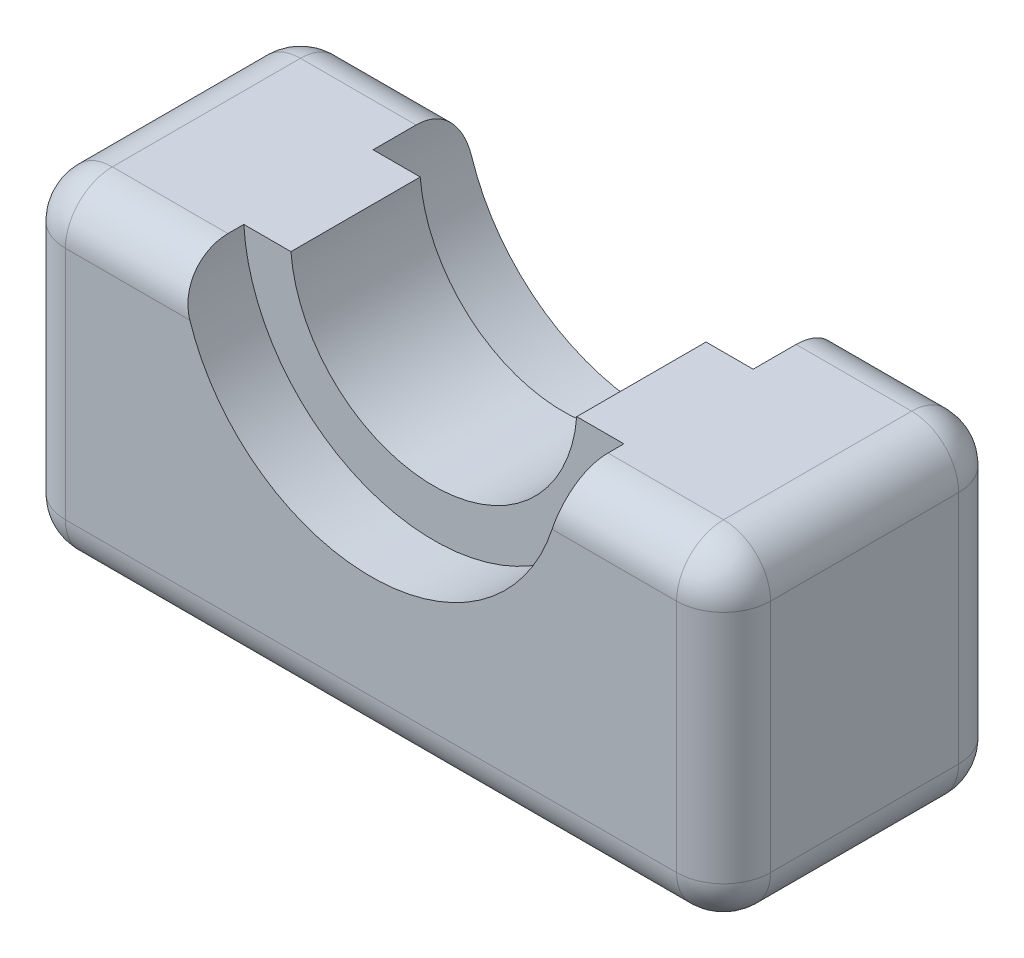
ISO-10303-21;
HEADER;
FILE_DESCRIPTION(('STEP AP214'),'2;1');
FILE_NAME('part.step','',(''),(''),'','','');
FILE_SCHEMA(('AUTOMOTIVE_DESIGN { 1 0 10303 214 1 1 1 1 }'));
ENDSEC;
DATA;
#1=APPLICATION_CONTEXT('core data for automotive mechanical design processes');
#2=APPLICATION_PROTOCOL_DEFINITION('international standard','automotive_design',2000,#1);
#3=PRODUCT_CONTEXT('',#1,'mechanical');
#4=PRODUCT('Part','Part','',(#3));
#5=PRODUCT_RELATED_PRODUCT_CATEGORY('part','',(#4));
#6=PRODUCT_DEFINITION_FORMATION('','',#4);
#7=PRODUCT_DEFINITION_CONTEXT('part definition',#1,'design');
#8=PRODUCT_DEFINITION('design','',#6,#7);
#9=PRODUCT_DEFINITION_SHAPE('','',#8);
#10=(LENGTH_UNIT() NAMED_UNIT(*) SI_UNIT(.MILLI.,.METRE.));
#11=(NAMED_UNIT(*) PLANE_ANGLE_UNIT() SI_UNIT($,.RADIAN.));
#12=(NAMED_UNIT(*) SI_UNIT($,.STERADIAN.) SOLID_ANGLE_UNIT());
#13=UNCERTAINTY_MEASURE_WITH_UNIT(LENGTH_MEASURE(1.E-05),#10,'distance_accuracy_value','');
#14=(GEOMETRIC_REPRESENTATION_CONTEXT(3) GLOBAL_UNCERTAINTY_ASSIGNED_CONTEXT((#13)) GLOBAL_UNIT_ASSIGNED_CONTEXT((#10,
#11,#12)) REPRESENTATION_CONTEXT('',''));
#15=CARTESIAN_POINT('',(0.,0.,0.));
#16=DIRECTION('',(0.,0.,1.));
#17=DIRECTION('',(1.,0.,0.));
#18=AXIS2_PLACEMENT_3D('',#15,#16,#17);
#19=CARTESIAN_POINT('',(-15.,7.,12.));
#20=DIRECTION('',(0.,-1.,0.));
#21=DIRECTION('',(0.,0.,-1.));
#22=AXIS2_PLACEMENT_3D('',#19,#20,#21);
#23=PLANE('',#22);
#24=DIRECTION('',(0.,0.,-1.));
#25=VECTOR('',#24,1.);
#26=CARTESIAN_POINT('',(-13.,7.,12.));
#27=LINE('',#26,#25);
#28=CARTESIAN_POINT('',(-13.,7.,2.));
#29=VERTEX_POINT('',#28);
#30=CARTESIAN_POINT('',(-13.,7.,10.));
#31=VERTEX_POINT('',#30);
#32=EDGE_CURVE('E242',#29,#31,#27,.F.);
#33=ORIENTED_EDGE('',*,*,#32,.T.);
#34=DIRECTION('',(-1.,0.,0.));
#35=VECTOR('',#34,1.);
#36=CARTESIAN_POINT('',(-15.,7.,10.));
#37=LINE('',#36,#35);
#38=CARTESIAN_POINT('',(-8.0845531725631,7.,10.));
#39=VERTEX_POINT('',#38);
#40=EDGE_CURVE('E245',#31,#39,#37,.F.);
#41=ORIENTED_EDGE('',*,*,#40,.T.);
#42=DIRECTION('',(0.,0.,-1.));
#43=VECTOR('',#42,1.);
#44=CARTESIAN_POINT('',(-8.0845531725631,7.,-4.41375541476271));
#45=LINE('',#44,#43);
#46=CARTESIAN_POINT('',(-8.0845531725631,7.,9.325));
#47=VERTEX_POINT('',#46);
#48=EDGE_CURVE('E196',#47,#39,#45,.F.);
#49=ORIENTED_EDGE('',*,*,#48,.F.);
#50=DIRECTION('',(-1.,0.,0.));
#51=VECTOR('',#50,1.);
#52=CARTESIAN_POINT('',(-15.,7.,9.32499999999999));
#53=LINE('',#52,#51);
#54=CARTESIAN_POINT('',(-6.07947366142827,7.,9.325));
#55=VERTEX_POINT('',#54);
#56=EDGE_CURVE('E228',#55,#47,#53,.T.);
#57=ORIENTED_EDGE('',*,*,#56,.F.);
#58=DIRECTION('',(0.,0.,-1.));
#59=VECTOR('',#58,1.);
#60=CARTESIAN_POINT('',(-6.07947366142827,7.,-4.41375541476271));
#61=LINE('',#60,#59);
#62=CARTESIAN_POINT('',(-6.07947366142827,7.,3.82499999999999));
#63=VERTEX_POINT('',#62);
#64=EDGE_CURVE('E229',#63,#55,#61,.F.);
#65=ORIENTED_EDGE('',*,*,#64,.F.);
#66=DIRECTION('',(1.,0.,0.));
#67=VECTOR('',#66,1.);
#68=CARTESIAN_POINT('',(-15.,7.,3.82499999999999));
#69=LINE('',#68,#67);
#70=CARTESIAN_POINT('',(-8.0845531725631,7.,3.82499999999999));
#71=VERTEX_POINT('',#70);
#72=EDGE_CURVE('E198',#71,#63,#69,.T.);
#73=ORIENTED_EDGE('',*,*,#72,.F.);
#74=DIRECTION('',(0.,0.,-1.));
#75=VECTOR('',#74,1.);
#76=CARTESIAN_POINT('',(-8.0845531725631,7.,-4.41375541476271));
#77=LINE('',#76,#75);
#78=CARTESIAN_POINT('',(-8.0845531725631,7.,2.));
#79=VERTEX_POINT('',#78);
#80=EDGE_CURVE('E206',#79,#71,#77,.F.);
#81=ORIENTED_EDGE('',*,*,#80,.F.);
#82=DIRECTION('',(-1.,0.,0.));
#83=VECTOR('',#82,1.);
#84=CARTESIAN_POINT('',(-15.,7.,2.));
#85=LINE('',#84,#83);
#86=EDGE_CURVE('E240',#79,#29,#85,.T.);
#87=ORIENTED_EDGE('',*,*,#86,.T.);
#88=EDGE_LOOP('',(#33,#41,#49,#57,#65,#73,#81,#87));
#89=FACE_BOUND('',#88,.T.);
#90=ADVANCED_FACE('F47',(#89),#23,.F.);
#91=DIRECTION('',(0.,0.,-1.));
#92=VECTOR('',#91,1.);
#93=CARTESIAN_POINT('',(8.0845531725631,7.,-4.41375541476271));
#94=LINE('',#93,#92);
#95=CARTESIAN_POINT('',(8.0845531725631,7.,10.));
#96=VERTEX_POINT('',#95);
#97=CARTESIAN_POINT('',(8.0845531725631,7.,9.325));
#98=VERTEX_POINT('',#97);
#99=EDGE_CURVE('E215',#96,#98,#94,.T.);
#100=ORIENTED_EDGE('',*,*,#99,.F.);
#101=DIRECTION('',(-1.,0.,0.));
#102=VECTOR('',#101,1.);
#103=CARTESIAN_POINT('',(-15.,7.,10.));
#104=LINE('',#103,#102);
#105=CARTESIAN_POINT('',(13.,7.,10.));
#106=VERTEX_POINT('',#105);
#107=EDGE_CURVE('E250',#96,#106,#104,.F.);
#108=ORIENTED_EDGE('',*,*,#107,.T.);
#109=DIRECTION('',(0.,0.,-1.));
#110=VECTOR('',#109,1.);
#111=CARTESIAN_POINT('',(13.,7.,12.));
#112=LINE('',#111,#110);
#113=CARTESIAN_POINT('',(13.,7.,2.));
#114=VERTEX_POINT('',#113);
#115=EDGE_CURVE('E248',#106,#114,#112,.T.);
#116=ORIENTED_EDGE('',*,*,#115,.T.);
#117=DIRECTION('',(-1.,0.,0.));
#118=VECTOR('',#117,1.);
#119=CARTESIAN_POINT('',(8.08455317256309,7.,2.));
#120=LINE('',#119,#118);
#121=CARTESIAN_POINT('',(8.0845531725631,7.,2.));
#122=VERTEX_POINT('',#121);
#123=EDGE_CURVE('E212',#114,#122,#120,.T.);
#124=ORIENTED_EDGE('',*,*,#123,.T.);
#125=DIRECTION('',(0.,0.,-1.));
#126=VECTOR('',#125,1.);
#127=CARTESIAN_POINT('',(8.0845531725631,7.,-4.41375541476271));
#128=LINE('',#127,#126);
#129=CARTESIAN_POINT('',(8.0845531725631,7.,3.82499999999999));
#130=VERTEX_POINT('',#129);
#131=EDGE_CURVE('E203',#130,#122,#128,.T.);
#132=ORIENTED_EDGE('',*,*,#131,.F.);
#133=CARTESIAN_POINT('',(6.07947366142827,7.,3.82499999999999));
#134=VERTEX_POINT('',#133);
#135=EDGE_CURVE('E185',#134,#130,#69,.T.);
#136=ORIENTED_EDGE('',*,*,#135,.F.);
#137=DIRECTION('',(0.,0.,-1.));
#138=VECTOR('',#137,1.);
#139=CARTESIAN_POINT('',(6.07947366142827,7.,-4.41375541476271));
#140=LINE('',#139,#138);
#141=CARTESIAN_POINT('',(6.07947366142827,7.,9.325));
#142=VERTEX_POINT('',#141);
#143=EDGE_CURVE('E195',#142,#134,#140,.T.);
#144=ORIENTED_EDGE('',*,*,#143,.F.);
#145=EDGE_CURVE('E226',#98,#142,#53,.T.);
#146=ORIENTED_EDGE('',*,*,#145,.F.);
#147=EDGE_LOOP('',(#100,#108,#116,#124,#132,#136,#144,#146));
#148=FACE_BOUND('',#147,.T.);
#149=ADVANCED_FACE('F210',(#148),#23,.F.);
#150=CARTESIAN_POINT('',(15.,-7.,12.));
#151=DIRECTION('',(-1.,0.,0.));
#152=DIRECTION('',(0.,0.,1.));
#153=AXIS2_PLACEMENT_3D('',#150,#151,#152);
#154=PLANE('',#153);
#155=DIRECTION('',(0.,0.,-1.));
#156=VECTOR('',#155,1.);
#157=CARTESIAN_POINT('',(15.,5.,12.));
#158=LINE('',#157,#156);
#159=CARTESIAN_POINT('',(15.,5.,2.));
#160=VERTEX_POINT('',#159);
#161=CARTESIAN_POINT('',(15.,5.,10.));
#162=VERTEX_POINT('',#161);
#163=EDGE_CURVE('E256',#160,#162,#158,.F.);
#164=ORIENTED_EDGE('',*,*,#163,.T.);
#165=DIRECTION('',(0.,1.,0.));
#166=VECTOR('',#165,1.);
#167=CARTESIAN_POINT('',(15.,-7.,10.));
#168=LINE('',#167,#166);
#169=CARTESIAN_POINT('',(15.,-5.,10.));
#170=VERTEX_POINT('',#169);
#171=EDGE_CURVE('E259',#162,#170,#168,.F.);
#172=ORIENTED_EDGE('',*,*,#171,.T.);
#173=DIRECTION('',(0.,0.,-1.));
#174=VECTOR('',#173,1.);
#175=CARTESIAN_POINT('',(15.,-5.,12.));
#176=LINE('',#175,#174);
#177=CARTESIAN_POINT('',(15.,-5.,2.));
#178=VERTEX_POINT('',#177);
#179=EDGE_CURVE('E254',#170,#178,#176,.T.);
#180=ORIENTED_EDGE('',*,*,#179,.T.);
#181=DIRECTION('',(0.,1.,0.));
#182=VECTOR('',#181,1.);
#183=CARTESIAN_POINT('',(15.,7.,2.));
#184=LINE('',#183,#182);
#185=EDGE_CURVE('E252',#178,#160,#184,.T.);
#186=ORIENTED_EDGE('',*,*,#185,.T.);
#187=EDGE_LOOP('',(#164,#172,#180,#186));
#188=FACE_BOUND('',#187,.T.);
#189=ADVANCED_FACE('F399',(#188),#154,.F.);
#190=CARTESIAN_POINT('',(-15.,-7.,12.));
#191=DIRECTION('',(1.,0.,0.));
#192=DIRECTION('',(0.,0.,-1.));
#193=AXIS2_PLACEMENT_3D('',#190,#191,#192);
#194=PLANE('',#193);
#195=DIRECTION('',(0.,0.,-1.));
#196=VECTOR('',#195,1.);
#197=CARTESIAN_POINT('',(-15.,-5.,12.));
#198=LINE('',#197,#196);
#199=CARTESIAN_POINT('',(-15.,-5.,2.));
#200=VERTEX_POINT('',#199);
#201=CARTESIAN_POINT('',(-15.,-5.,10.));
#202=VERTEX_POINT('',#201);
#203=EDGE_CURVE('E233',#200,#202,#198,.F.);
#204=ORIENTED_EDGE('',*,*,#203,.T.);
#205=DIRECTION('',(0.,-1.,0.));
#206=VECTOR('',#205,1.);
#207=CARTESIAN_POINT('',(-15.,-7.,10.));
#208=LINE('',#207,#206);
#209=CARTESIAN_POINT('',(-15.,5.,10.));
#210=VERTEX_POINT('',#209);
#211=EDGE_CURVE('E238',#202,#210,#208,.F.);
#212=ORIENTED_EDGE('',*,*,#211,.T.);
#213=DIRECTION('',(0.,0.,-1.));
#214=VECTOR('',#213,1.);
#215=CARTESIAN_POINT('',(-15.,5.,12.));
#216=LINE('',#215,#214);
#217=CARTESIAN_POINT('',(-15.,5.,2.));
#218=VERTEX_POINT('',#217);
#219=EDGE_CURVE('E235',#210,#218,#216,.T.);
#220=ORIENTED_EDGE('',*,*,#219,.T.);
#221=DIRECTION('',(0.,-1.,0.));
#222=VECTOR('',#221,1.);
#223=CARTESIAN_POINT('',(-15.,-7.,2.));
#224=LINE('',#223,#222);
#225=EDGE_CURVE('E231',#218,#200,#224,.T.);
#226=ORIENTED_EDGE('',*,*,#225,.T.);
#227=EDGE_LOOP('',(#204,#212,#220,#226));
#228=FACE_BOUND('',#227,.T.);
#229=ADVANCED_FACE('F402',(#228),#194,.F.);
#230=CARTESIAN_POINT('',(-15.,-7.,12.));
#231=DIRECTION('',(0.,1.,0.));
#232=DIRECTION('',(0.,0.,1.));
#233=AXIS2_PLACEMENT_3D('',#230,#231,#232);
#234=PLANE('',#233);
#235=DIRECTION('',(1.,0.,0.));
#236=VECTOR('',#235,1.);
#237=CARTESIAN_POINT('',(-15.,-7.,10.));
#238=LINE('',#237,#236);
#239=CARTESIAN_POINT('',(13.,-7.,10.));
#240=VERTEX_POINT('',#239);
#241=CARTESIAN_POINT('',(-13.,-7.,10.));
#242=VERTEX_POINT('',#241);
#243=EDGE_CURVE('E261',#240,#242,#238,.F.);
#244=ORIENTED_EDGE('',*,*,#243,.T.);
#245=DIRECTION('',(0.,0.,-1.));
#246=VECTOR('',#245,1.);
#247=CARTESIAN_POINT('',(-13.,-7.,12.));
#248=LINE('',#247,#246);
#249=CARTESIAN_POINT('',(-13.,-7.,2.));
#250=VERTEX_POINT('',#249);
#251=EDGE_CURVE('E267',#242,#250,#248,.T.);
#252=ORIENTED_EDGE('',*,*,#251,.T.);
#253=DIRECTION('',(1.,0.,0.));
#254=VECTOR('',#253,1.);
#255=CARTESIAN_POINT('',(15.,-7.,2.));
#256=LINE('',#255,#254);
#257=CARTESIAN_POINT('',(13.,-7.,2.));
#258=VERTEX_POINT('',#257);
#259=EDGE_CURVE('E265',#250,#258,#256,.T.);
#260=ORIENTED_EDGE('',*,*,#259,.T.);
#261=DIRECTION('',(0.,0.,-1.));
#262=VECTOR('',#261,1.);
#263=CARTESIAN_POINT('',(13.,-7.,12.));
#264=LINE('',#263,#262);
#265=EDGE_CURVE('E263',#258,#240,#264,.F.);
#266=ORIENTED_EDGE('',*,*,#265,.T.);
#267=EDGE_LOOP('',(#244,#252,#260,#266));
#268=FACE_BOUND('',#267,.T.);
#269=ADVANCED_FACE('F545',(#268),#234,.F.);
#270=CARTESIAN_POINT('',(0.,0.,12.));
#271=DIRECTION('',(0.,0.,-1.));
#272=DIRECTION('',(-1.,0.,0.));
#273=AXIS2_PLACEMENT_3D('',#270,#271,#272);
#274=PLANE('',#273);
#275=DIRECTION('',(0.,1.,0.));
#276=VECTOR('',#275,1.);
#277=CARTESIAN_POINT('',(13.,0.,12.));
#278=LINE('',#277,#276);
#279=CARTESIAN_POINT('',(13.,-5.,12.));
#280=VERTEX_POINT('',#279);
#281=CARTESIAN_POINT('',(13.,5.,12.));
#282=VERTEX_POINT('',#281);
#283=EDGE_CURVE('E65',#280,#282,#278,.T.);
#284=ORIENTED_EDGE('',*,*,#283,.T.);
#285=DIRECTION('',(-1.,0.,0.));
#286=VECTOR('',#285,1.);
#287=CARTESIAN_POINT('',(0.,5.,12.));
#288=LINE('',#287,#286);
#289=CARTESIAN_POINT('',(7.70454411370329,5.,12.));
#290=VERTEX_POINT('',#289);
#291=EDGE_CURVE('E286',#282,#290,#288,.T.);
#292=ORIENTED_EDGE('',*,*,#291,.T.);
#293=CARTESIAN_POINT('',(0.,7.5,12.));
#294=DIRECTION('',(0.,0.,-1.));
#295=DIRECTION('',(-1.,0.,0.));
#296=AXIS2_PLACEMENT_3D('',#293,#294,#295);
#297=CIRCLE('',#296,8.1);
#298=CARTESIAN_POINT('',(-7.70454411370329,5.,12.));
#299=VERTEX_POINT('',#298);
#300=EDGE_CURVE('E213',#290,#299,#297,.T.);
#301=ORIENTED_EDGE('',*,*,#300,.T.);
#302=DIRECTION('',(-1.,0.,0.));
#303=VECTOR('',#302,1.);
#304=CARTESIAN_POINT('',(0.,5.,12.));
#305=LINE('',#304,#303);
#306=CARTESIAN_POINT('',(-13.,5.,12.));
#307=VERTEX_POINT('',#306);
#308=EDGE_CURVE('E282',#299,#307,#305,.T.);
#309=ORIENTED_EDGE('',*,*,#308,.T.);
#310=DIRECTION('',(0.,-1.,0.));
#311=VECTOR('',#310,1.);
#312=CARTESIAN_POINT('',(-13.,0.,12.));
#313=LINE('',#312,#311);
#314=CARTESIAN_POINT('',(-13.,-5.,12.));
#315=VERTEX_POINT('',#314);
#316=EDGE_CURVE('E280',#307,#315,#313,.T.);
#317=ORIENTED_EDGE('',*,*,#316,.T.);
#318=DIRECTION('',(1.,0.,0.));
#319=VECTOR('',#318,1.);
#320=CARTESIAN_POINT('',(0.,-5.,12.));
#321=LINE('',#320,#319);
#322=EDGE_CURVE('E70',#315,#280,#321,.T.);
#323=ORIENTED_EDGE('',*,*,#322,.T.);
#324=EDGE_LOOP('',(#284,#292,#301,#309,#317,#323));
#325=FACE_BOUND('',#324,.T.);
#326=ADVANCED_FACE('F390',(#325),#274,.F.);
#327=CARTESIAN_POINT('',(0.,0.,0.));
#328=DIRECTION('',(0.,0.,-1.));
#329=DIRECTION('',(-1.,0.,0.));
#330=AXIS2_PLACEMENT_3D('',#327,#328,#329);
#331=PLANE('',#330);
#332=CARTESIAN_POINT('',(0.,7.5,0.));
#333=DIRECTION('',(0.,0.,-1.));
#334=DIRECTION('',(-1.,0.,0.));
#335=AXIS2_PLACEMENT_3D('',#332,#333,#334);
#336=CIRCLE('',#335,8.1);
#337=CARTESIAN_POINT('',(7.70454411370329,5.,0.));
#338=VERTEX_POINT('',#337);
#339=CARTESIAN_POINT('',(-7.70454411370329,5.,0.));
#340=VERTEX_POINT('',#339);
#341=EDGE_CURVE('E207',#338,#340,#336,.T.);
#342=ORIENTED_EDGE('',*,*,#341,.F.);
#343=DIRECTION('',(-1.,0.,0.));
#344=VECTOR('',#343,1.);
#345=CARTESIAN_POINT('',(15.,5.,0.));
#346=LINE('',#345,#344);
#347=CARTESIAN_POINT('',(13.,5.,0.));
#348=VERTEX_POINT('',#347);
#349=EDGE_CURVE('E278',#338,#348,#346,.F.);
#350=ORIENTED_EDGE('',*,*,#349,.T.);
#351=DIRECTION('',(0.,1.,0.));
#352=VECTOR('',#351,1.);
#353=CARTESIAN_POINT('',(13.,-7.,0.));
#354=LINE('',#353,#352);
#355=CARTESIAN_POINT('',(13.,-5.,0.));
#356=VERTEX_POINT('',#355);
#357=EDGE_CURVE('E276',#348,#356,#354,.F.);
#358=ORIENTED_EDGE('',*,*,#357,.T.);
#359=DIRECTION('',(1.,0.,0.));
#360=VECTOR('',#359,1.);
#361=CARTESIAN_POINT('',(-15.,-5.,0.));
#362=LINE('',#361,#360);
#363=CARTESIAN_POINT('',(-13.,-5.,0.));
#364=VERTEX_POINT('',#363);
#365=EDGE_CURVE('E274',#356,#364,#362,.F.);
#366=ORIENTED_EDGE('',*,*,#365,.T.);
#367=DIRECTION('',(0.,-1.,0.));
#368=VECTOR('',#367,1.);
#369=CARTESIAN_POINT('',(-13.,7.,0.));
#370=LINE('',#369,#368);
#371=CARTESIAN_POINT('',(-13.,5.,0.));
#372=VERTEX_POINT('',#371);
#373=EDGE_CURVE('E270',#364,#372,#370,.F.);
#374=ORIENTED_EDGE('',*,*,#373,.T.);
#375=DIRECTION('',(-1.,0.,0.));
#376=VECTOR('',#375,1.);
#377=CARTESIAN_POINT('',(-8.0845531725631,5.,0.));
#378=LINE('',#377,#376);
#379=EDGE_CURVE('E272',#372,#340,#378,.F.);
#380=ORIENTED_EDGE('',*,*,#379,.T.);
#381=EDGE_LOOP('',(#342,#350,#358,#366,#374,#380));
#382=FACE_BOUND('',#381,.T.);
#383=ADVANCED_FACE('F385',(#382),#331,.T.);
#384=CARTESIAN_POINT('',(8.1,7.5,9.32499999999999));
#385=DIRECTION('',(0.,0.,1.));
#386=DIRECTION('',(1.,0.,0.));
#387=AXIS2_PLACEMENT_3D('',#384,#385,#386);
#388=PLANE('',#387);
#389=ORIENTED_EDGE('',*,*,#145,.T.);
#390=CARTESIAN_POINT('',(0.,7.5,9.325));
#391=DIRECTION('',(0.,0.,-1.));
#392=DIRECTION('',(-1.,0.,0.));
#393=AXIS2_PLACEMENT_3D('',#390,#391,#392);
#394=CIRCLE('',#393,6.1);
#395=EDGE_CURVE('E496',#142,#55,#394,.T.);
#396=ORIENTED_EDGE('',*,*,#395,.T.);
#397=ORIENTED_EDGE('',*,*,#56,.T.);
#398=CARTESIAN_POINT('',(0.,7.5,9.325));
#399=DIRECTION('',(0.,0.,-1.));
#400=DIRECTION('',(-1.,0.,0.));
#401=AXIS2_PLACEMENT_3D('',#398,#399,#400);
#402=CIRCLE('',#401,8.1);
#403=EDGE_CURVE('E218',#98,#47,#402,.T.);
#404=ORIENTED_EDGE('',*,*,#403,.F.);
#405=EDGE_LOOP('',(#389,#396,#397,#404));
#406=FACE_BOUND('',#405,.T.);
#407=ADVANCED_FACE('F382',(#406),#388,.T.);
#408=CARTESIAN_POINT('',(0.,7.5,-4.41375541476271));
#409=DIRECTION('',(0.,0.,-1.));
#410=DIRECTION('',(-1.,0.,0.));
#411=AXIS2_PLACEMENT_3D('',#408,#409,#410);
#412=CYLINDRICAL_SURFACE('',#411,6.1);
#413=ORIENTED_EDGE('',*,*,#64,.T.);
#414=ORIENTED_EDGE('',*,*,#395,.F.);
#415=ORIENTED_EDGE('',*,*,#143,.T.);
#416=CARTESIAN_POINT('',(0.,7.5,3.82499999999999));
#417=DIRECTION('',(0.,0.,-1.));
#418=DIRECTION('',(-1.,0.,0.));
#419=AXIS2_PLACEMENT_3D('',#416,#417,#418);
#420=CIRCLE('',#419,6.1);
#421=EDGE_CURVE('E191',#134,#63,#420,.T.);
#422=ORIENTED_EDGE('',*,*,#421,.T.);
#423=EDGE_LOOP('',(#413,#414,#415,#422));
#424=FACE_BOUND('',#423,.T.);
#425=ADVANCED_FACE('F380',(#424),#412,.F.);
#426=CARTESIAN_POINT('',(6.1,7.5,3.82499999999999));
#427=DIRECTION('',(0.,0.,-1.));
#428=DIRECTION('',(-1.,0.,0.));
#429=AXIS2_PLACEMENT_3D('',#426,#427,#428);
#430=PLANE('',#429);
#431=ORIENTED_EDGE('',*,*,#72,.T.);
#432=ORIENTED_EDGE('',*,*,#421,.F.);
#433=ORIENTED_EDGE('',*,*,#135,.T.);
#434=CARTESIAN_POINT('',(0.,7.5,3.82499999999999));
#435=DIRECTION('',(0.,0.,-1.));
#436=DIRECTION('',(-1.,0.,0.));
#437=AXIS2_PLACEMENT_3D('',#434,#435,#436);
#438=CIRCLE('',#437,8.1);
#439=EDGE_CURVE('E188',#130,#71,#438,.T.);
#440=ORIENTED_EDGE('',*,*,#439,.T.);
#441=EDGE_LOOP('',(#431,#432,#433,#440));
#442=FACE_BOUND('',#441,.T.);
#443=ADVANCED_FACE('F187',(#442),#430,.T.);
#444=CARTESIAN_POINT('',(0.,7.5,-4.41375541476271));
#445=DIRECTION('',(0.,0.,-1.));
#446=DIRECTION('',(-1.,0.,0.));
#447=AXIS2_PLACEMENT_3D('',#444,#445,#446);
#448=CYLINDRICAL_SURFACE('',#447,8.1);
#449=ORIENTED_EDGE('',*,*,#300,.F.);
#450=CARTESIAN_POINT('',(7.70454411370329,5.,12.));
#451=CARTESIAN_POINT('',(7.72221733940313,5.05445630783001,11.9999991391625));
#452=CARTESIAN_POINT('',(7.73930046538512,5.10908208849837,11.9977740298829));
#453=CARTESIAN_POINT('',(7.77221558333223,5.218352249234,11.988801788701));
#454=CARTESIAN_POINT('',(7.78804727575902,5.27299663062898,11.9820535778084));
#455=CARTESIAN_POINT('',(7.83353005142658,5.43637863963121,11.9549253241192));
#456=CARTESIAN_POINT('',(7.86118815572091,5.54462489477543,11.9276618150118));
#457=CARTESIAN_POINT('',(7.91085314314783,5.75635990814549,11.8548556849213));
#458=CARTESIAN_POINT('',(7.93284913711485,5.85983918965886,11.8092782678684));
#459=CARTESIAN_POINT('',(7.97131097957193,6.05832840377433,11.700797672422));
#460=CARTESIAN_POINT('',(7.98778113660569,6.15334489222874,11.6379080624818));
#461=CARTESIAN_POINT('',(8.01541277739852,6.32915834972679,11.4985211081995));
#462=CARTESIAN_POINT('',(8.02671333636947,6.41028572229722,11.422467223029));
#463=CARTESIAN_POINT('',(8.04550858613133,6.55902905238382,11.2576763866301));
#464=CARTESIAN_POINT('',(8.05300200664451,6.62664049566007,11.1689352148406));
#465=CARTESIAN_POINT('',(8.06505577524296,6.74602632383817,10.981673685788));
#466=CARTESIAN_POINT('',(8.06962682086515,6.79785810179217,10.8831905369422));
#467=CARTESIAN_POINT('',(8.0766977613671,6.88449153627053,10.6789557925763));
#468=CARTESIAN_POINT('',(8.07919867464249,6.91930156314255,10.5732077987386));
#469=CARTESIAN_POINT('',(8.08222320874333,6.96333718971312,10.3891690309199));
#470=CARTESIAN_POINT('',(8.08311176358907,6.97707353831897,10.3119311762075));
#471=CARTESIAN_POINT('',(8.08426907149497,6.99540658730904,10.1564721000259));
#472=CARTESIAN_POINT('',(8.08453859907028,7.0000147077644,10.0782522306427));
#473=CARTESIAN_POINT('',(8.0845531725631,7.,10.));
#474=B_SPLINE_CURVE_WITH_KNOTS('',3,(#450,#451,#452,#453,#454,#455,#456,#457,#458,#459,#460,
#461,#462,#463,#464,#465,#466,#467,#468,#469,#470,#471,#472,#473),.UNSPECIFIED.,.F.,.F.,(4,2,2,
2,2,2,2,2,2,2,2,4),(0.,0.171665039148945,0.343371043738461,0.686596939227762,1.03047806430713,
1.37409043571894,1.70781887223384,2.04165858651308,2.37426915476356,2.70671599879677,
2.94156815579039,3.17612630978022),.UNSPECIFIED.);
#475=EDGE_CURVE('E295',#290,#96,#474,.T.);
#476=ORIENTED_EDGE('',*,*,#475,.T.);
#477=ORIENTED_EDGE('',*,*,#99,.T.);
#478=ORIENTED_EDGE('',*,*,#403,.T.);
#479=ORIENTED_EDGE('',*,*,#48,.T.);
#480=CARTESIAN_POINT('',(-8.0845531725631,7.,10.));
#481=CARTESIAN_POINT('',(-8.08454980548533,6.99999965423769,10.0560645785242));
#482=CARTESIAN_POINT('',(-8.08440766001303,6.99764107634881,10.1121023809767));
#483=CARTESIAN_POINT('',(-8.08381878791316,6.98823194226895,10.2237789659602));
#484=CARTESIAN_POINT('',(-8.08337207215608,6.98118155353471,10.2794177626607));
#485=CARTESIAN_POINT('',(-8.08153632306573,6.95305673653088,10.4450609865663));
#486=CARTESIAN_POINT('',(-8.07965183551945,6.9250084927778,10.5539591096366));
#487=CARTESIAN_POINT('',(-8.0740506517572,6.85110591845108,10.7654953140518));
#488=CARTESIAN_POINT('',(-8.07033292724994,6.80524159762912,10.8681298456999));
#489=CARTESIAN_POINT('',(-8.0602875284919,6.69706560419468,11.0641859329372));
#490=CARTESIAN_POINT('',(-8.05396039935022,6.63475736772279,11.1576094076843));
#491=CARTESIAN_POINT('',(-8.0378188909054,6.49584715344973,11.3322330543309));
#492=CARTESIAN_POINT('',(-8.02801746259071,6.41929875494283,11.4134770479865));
#493=CARTESIAN_POINT('',(-8.00405098608367,6.25416277329699,11.5618554473494));
#494=CARTESIAN_POINT('',(-7.98988633179285,6.16557627733179,11.6289911258014));
#495=CARTESIAN_POINT('',(-7.95664395091099,5.97992331128564,11.7469283229109));
#496=CARTESIAN_POINT('',(-7.93760366827528,5.88292503973029,11.7978479706101));
#497=CARTESIAN_POINT('',(-7.89421913393356,5.68292487527609,11.8829283128417));
#498=CARTESIAN_POINT('',(-7.86987438469021,5.57992241987354,11.917087434327));
#499=CARTESIAN_POINT('',(-7.82265176540555,5.39697757260031,11.9618770992592));
#500=CARTESIAN_POINT('',(-7.80089876043411,5.31762852281883,11.9762364055768));
#501=CARTESIAN_POINT('',(-7.75469639405478,5.15871597923491,11.9952993012304));
#502=CARTESIAN_POINT('',(-7.73025217359827,5.07915316810061,12.0000209749964));
#503=CARTESIAN_POINT('',(-7.70454411370329,5.,12.));
#504=B_SPLINE_CURVE_WITH_KNOTS('',3,(#480,#481,#482,#483,#484,#485,#486,#487,#488,#489,#490,
#491,#492,#493,#494,#495,#496,#497,#498,#499,#500,#501,#502,#503),.UNSPECIFIED.,.F.,.F.,(4,2,2,
2,2,2,2,2,2,2,2,4),(0.,0.168090725906928,0.336175452762153,0.671850672590525,1.00771439244278,
1.34350798529702,1.67806279582266,2.01258741239305,2.34461620439159,2.6766761527536,
2.9266564566506,3.17616725491293),.UNSPECIFIED.);
#505=EDGE_CURVE('E288',#39,#299,#504,.T.);
#506=ORIENTED_EDGE('',*,*,#505,.T.);
#507=EDGE_LOOP('',(#449,#476,#477,#478,#479,#506));
#508=FACE_BOUND('',#507,.T.);
#509=ADVANCED_FACE('F300',(#508),#448,.F.);
#510=CARTESIAN_POINT('',(0.,7.5,-4.41375541476271));
#511=DIRECTION('',(0.,0.,-1.));
#512=DIRECTION('',(-1.,0.,0.));
#513=AXIS2_PLACEMENT_3D('',#510,#511,#512);
#514=CYLINDRICAL_SURFACE('',#513,8.1);
#515=ORIENTED_EDGE('',*,*,#341,.T.);
#516=CARTESIAN_POINT('',(-7.70454411370329,5.,0.));
#517=CARTESIAN_POINT('',(-7.72221733940313,5.05445630783001,8.60837539976863E-07));
#518=CARTESIAN_POINT('',(-7.73930046538512,5.10908208849837,0.0022259701170716));
#519=CARTESIAN_POINT('',(-7.77221558333223,5.218352249234,0.0111982112989936));
#520=CARTESIAN_POINT('',(-7.78804727575902,5.27299663062898,0.0179464221915945));
#521=CARTESIAN_POINT('',(-7.83353005142658,5.43637863963121,0.0450746758807502));
#522=CARTESIAN_POINT('',(-7.86118815572091,5.54462489477543,0.0723381849882116));
#523=CARTESIAN_POINT('',(-7.91085314314783,5.75635990814548,0.145144315078657));
#524=CARTESIAN_POINT('',(-7.93284913711485,5.85983918965886,0.190721732131642));
#525=CARTESIAN_POINT('',(-7.97131097957193,6.05832840377432,0.299202327577996));
#526=CARTESIAN_POINT('',(-7.98778113660569,6.15334489222874,0.362091937518172));
#527=CARTESIAN_POINT('',(-8.01541277739852,6.32915834972679,0.501478891800465));
#528=CARTESIAN_POINT('',(-8.02671333636947,6.41028572229722,0.577532776971042));
#529=CARTESIAN_POINT('',(-8.04550858613132,6.55902905238382,0.74232361336989));
#530=CARTESIAN_POINT('',(-8.0530020066445,6.62664049566007,0.831064785159433));
#531=CARTESIAN_POINT('',(-8.06505577524296,6.74602632383817,1.01832631421201));
#532=CARTESIAN_POINT('',(-8.06962682086515,6.79785810179217,1.11680946305782));
#533=CARTESIAN_POINT('',(-8.0766977613671,6.88449153627053,1.32104420742375));
#534=CARTESIAN_POINT('',(-8.07919867464248,6.91930156314255,1.42679220126139));
#535=CARTESIAN_POINT('',(-8.08222320874333,6.96333718971312,1.61083096908014));
#536=CARTESIAN_POINT('',(-8.08311176358907,6.97707353831897,1.68806882379254));
#537=CARTESIAN_POINT('',(-8.08426907149497,6.99540658730904,1.84352789997413));
#538=CARTESIAN_POINT('',(-8.08453859907028,7.0000147077644,1.92174776935732));
#539=CARTESIAN_POINT('',(-8.0845531725631,7.,2.));
#540=B_SPLINE_CURVE_WITH_KNOTS('',3,(#516,#517,#518,#519,#520,#521,#522,#523,#524,#525,#526,
#527,#528,#529,#530,#531,#532,#533,#534,#535,#536,#537,#538,#539),.UNSPECIFIED.,.F.,.F.,(4,2,2,
2,2,2,2,2,2,2,2,4),(0.,0.171665039148945,0.343371043738462,0.686596939227761,1.03047806430713,
1.37409043571894,1.70781887223384,2.04165858651308,2.37426915476355,2.70671599879677,
2.94156815579039,3.17612630978022),.UNSPECIFIED.);
#541=EDGE_CURVE('E13',#340,#79,#540,.T.);
#542=ORIENTED_EDGE('',*,*,#541,.T.);
#543=ORIENTED_EDGE('',*,*,#80,.T.);
#544=ORIENTED_EDGE('',*,*,#439,.F.);
#545=ORIENTED_EDGE('',*,*,#131,.T.);
#546=CARTESIAN_POINT('',(8.0845531725631,7.,2.));
#547=CARTESIAN_POINT('',(8.08454980548532,6.99999965423769,1.94393542147583));
#548=CARTESIAN_POINT('',(8.08440766001302,6.99764107634881,1.88789761902335));
#549=CARTESIAN_POINT('',(8.08381878791316,6.98823194226895,1.77622103403978));
#550=CARTESIAN_POINT('',(8.08337207215608,6.98118155353471,1.72058223733931));
#551=CARTESIAN_POINT('',(8.08153632306573,6.95305673653088,1.5549390134337));
#552=CARTESIAN_POINT('',(8.07965183551945,6.9250084927778,1.44604089036338));
#553=CARTESIAN_POINT('',(8.07405065175719,6.85110591845108,1.23450468594821));
#554=CARTESIAN_POINT('',(8.07033292724994,6.80524159762912,1.13187015430007));
#555=CARTESIAN_POINT('',(8.06028752849189,6.69706560419468,0.935814067062837));
#556=CARTESIAN_POINT('',(8.05396039935022,6.6347573677228,0.842390592315726));
#557=CARTESIAN_POINT('',(8.0378188909054,6.49584715344973,0.667766945669111));
#558=CARTESIAN_POINT('',(8.02801746259071,6.41929875494283,0.586522952013551));
#559=CARTESIAN_POINT('',(8.00405098608367,6.25416277329699,0.438144552650646));
#560=CARTESIAN_POINT('',(7.98988633179284,6.16557627733179,0.371008874198565));
#561=CARTESIAN_POINT('',(7.95664395091099,5.97992331128564,0.253071677089142));
#562=CARTESIAN_POINT('',(7.93760366827528,5.88292503973029,0.202152029389876));
#563=CARTESIAN_POINT('',(7.89421913393356,5.68292487527609,0.117071687158309));
#564=CARTESIAN_POINT('',(7.86987438469021,5.57992241987354,0.0829125656730387));
#565=CARTESIAN_POINT('',(7.82265176540555,5.39697757260032,0.0381229007408486));
#566=CARTESIAN_POINT('',(7.80089876043411,5.31762852281883,0.0237635944231886));
#567=CARTESIAN_POINT('',(7.75469639405478,5.15871597923491,0.00470069876961589));
#568=CARTESIAN_POINT('',(7.73025217359827,5.07915316810061,-2.09749963729266E-05));
#569=CARTESIAN_POINT('',(7.70454411370329,5.,0.));
#570=B_SPLINE_CURVE_WITH_KNOTS('',3,(#546,#547,#548,#549,#550,#551,#552,#553,#554,#555,#556,
#557,#558,#559,#560,#561,#562,#563,#564,#565,#566,#567,#568,#569),.UNSPECIFIED.,.F.,.F.,(4,2,2,
2,2,2,2,2,2,2,2,4),(0.,0.168090725906928,0.336175452762154,0.671850672590525,1.00771439244278,
1.34350798529702,1.67806279582266,2.01258741239306,2.34461620439159,2.6766761527536,
2.9266564566506,3.17616725491293),.UNSPECIFIED.);
#571=EDGE_CURVE('E57',#122,#338,#570,.T.);
#572=ORIENTED_EDGE('',*,*,#571,.T.);
#573=EDGE_LOOP('',(#515,#542,#543,#544,#545,#572));
#574=FACE_BOUND('',#573,.T.);
#575=ADVANCED_FACE('F202',(#574),#514,.F.);
#576=CARTESIAN_POINT('',(0.,5.,10.));
#577=DIRECTION('',(-1.,0.,0.));
#578=DIRECTION('',(0.,0.,1.));
#579=AXIS2_PLACEMENT_3D('',#576,#577,#578);
#580=CYLINDRICAL_SURFACE('',#579,2.);
#581=ORIENTED_EDGE('',*,*,#475,.F.);
#582=ORIENTED_EDGE('',*,*,#291,.F.);
#583=CARTESIAN_POINT('',(13.,5.,10.));
#584=DIRECTION('',(1.,0.,0.));
#585=DIRECTION('',(0.,0.,-1.));
#586=AXIS2_PLACEMENT_3D('',#583,#584,#585);
#587=CIRCLE('',#586,2.);
#588=EDGE_CURVE('E52',#106,#282,#587,.T.);
#589=ORIENTED_EDGE('',*,*,#588,.F.);
#590=ORIENTED_EDGE('',*,*,#107,.F.);
#591=EDGE_LOOP('',(#581,#582,#589,#590));
#592=FACE_BOUND('',#591,.T.);
#593=ADVANCED_FACE('F49',(#592),#580,.T.);
#594=CARTESIAN_POINT('',(13.,5.,12.));
#595=DIRECTION('',(0.,0.,-1.));
#596=DIRECTION('',(-1.,0.,0.));
#597=AXIS2_PLACEMENT_3D('',#594,#595,#596);
#598=CYLINDRICAL_SURFACE('',#597,2.);
#599=CARTESIAN_POINT('',(13.,5.,2.));
#600=DIRECTION('',(0.,0.,-1.));
#601=DIRECTION('',(-1.,0.,0.));
#602=AXIS2_PLACEMENT_3D('',#599,#600,#601);
#603=CIRCLE('',#602,2.);
#604=EDGE_CURVE('E483',#114,#160,#603,.T.);
#605=ORIENTED_EDGE('',*,*,#604,.F.);
#606=ORIENTED_EDGE('',*,*,#115,.F.);
#607=CARTESIAN_POINT('',(13.,5.,10.));
#608=DIRECTION('',(0.,0.,1.));
#609=DIRECTION('',(1.,0.,0.));
#610=AXIS2_PLACEMENT_3D('',#607,#608,#609);
#611=CIRCLE('',#610,2.);
#612=EDGE_CURVE('E485',#162,#106,#611,.T.);
#613=ORIENTED_EDGE('',*,*,#612,.F.);
#614=ORIENTED_EDGE('',*,*,#163,.F.);
#615=EDGE_LOOP('',(#605,#606,#613,#614));
#616=FACE_BOUND('',#615,.T.);
#617=ADVANCED_FACE('F363',(#616),#598,.T.);
#618=CARTESIAN_POINT('',(-15.,5.,2.));
#619=DIRECTION('',(1.,0.,0.));
#620=DIRECTION('',(0.,0.,-1.));
#621=AXIS2_PLACEMENT_3D('',#618,#619,#620);
#622=CYLINDRICAL_SURFACE('',#621,2.);
#623=ORIENTED_EDGE('',*,*,#571,.F.);
#624=ORIENTED_EDGE('',*,*,#123,.F.);
#625=CARTESIAN_POINT('',(13.,5.,2.));
#626=DIRECTION('',(1.,0.,0.));
#627=DIRECTION('',(0.,1.,0.));
#628=AXIS2_PLACEMENT_3D('',#625,#626,#627);
#629=CIRCLE('',#628,2.);
#630=EDGE_CURVE('E480',#348,#114,#629,.T.);
#631=ORIENTED_EDGE('',*,*,#630,.F.);
#632=ORIENTED_EDGE('',*,*,#349,.F.);
#633=EDGE_LOOP('',(#623,#624,#631,#632));
#634=FACE_BOUND('',#633,.T.);
#635=ADVANCED_FACE('F359',(#634),#622,.T.);
#636=CARTESIAN_POINT('',(13.,5.,10.));
#637=DIRECTION('',(0.,0.,1.));
#638=DIRECTION('',(1.,0.,0.));
#639=AXIS2_PLACEMENT_3D('',#636,#637,#638);
#640=SPHERICAL_SURFACE('',#639,2.);
#641=ORIENTED_EDGE('',*,*,#612,.T.);
#642=ORIENTED_EDGE('',*,*,#588,.T.);
#643=CARTESIAN_POINT('',(13.,5.,10.));
#644=DIRECTION('',(0.,1.,0.));
#645=DIRECTION('',(0.,0.,1.));
#646=AXIS2_PLACEMENT_3D('',#643,#644,#645);
#647=CIRCLE('',#646,2.);
#648=EDGE_CURVE('E477',#162,#282,#647,.F.);
#649=ORIENTED_EDGE('',*,*,#648,.F.);
#650=EDGE_LOOP('',(#641,#642,#649));
#651=FACE_BOUND('',#650,.T.);
#652=ADVANCED_FACE('F355',(#651),#640,.T.);
#653=CARTESIAN_POINT('',(13.,5.,2.));
#654=DIRECTION('',(0.,0.,1.));
#655=DIRECTION('',(1.,0.,0.));
#656=AXIS2_PLACEMENT_3D('',#653,#654,#655);
#657=SPHERICAL_SURFACE('',#656,2.);
#658=ORIENTED_EDGE('',*,*,#630,.T.);
#659=ORIENTED_EDGE('',*,*,#604,.T.);
#660=CARTESIAN_POINT('',(13.,5.,2.));
#661=DIRECTION('',(0.,1.,0.));
#662=DIRECTION('',(0.,0.,1.));
#663=AXIS2_PLACEMENT_3D('',#660,#661,#662);
#664=CIRCLE('',#663,2.);
#665=EDGE_CURVE('E474',#348,#160,#664,.F.);
#666=ORIENTED_EDGE('',*,*,#665,.F.);
#667=EDGE_LOOP('',(#658,#659,#666));
#668=FACE_BOUND('',#667,.T.);
#669=ADVANCED_FACE('F351',(#668),#657,.T.);
#670=CARTESIAN_POINT('',(13.,0.,10.));
#671=DIRECTION('',(0.,1.,0.));
#672=DIRECTION('',(0.,0.,1.));
#673=AXIS2_PLACEMENT_3D('',#670,#671,#672);
#674=CYLINDRICAL_SURFACE('',#673,2.);
#675=ORIENTED_EDGE('',*,*,#648,.T.);
#676=ORIENTED_EDGE('',*,*,#283,.F.);
#677=CARTESIAN_POINT('',(13.,-5.,10.));
#678=DIRECTION('',(0.,-1.,0.));
#679=DIRECTION('',(0.,0.,-1.));
#680=AXIS2_PLACEMENT_3D('',#677,#678,#679);
#681=CIRCLE('',#680,2.);
#682=EDGE_CURVE('E471',#170,#280,#681,.T.);
#683=ORIENTED_EDGE('',*,*,#682,.F.);
#684=ORIENTED_EDGE('',*,*,#171,.F.);
#685=EDGE_LOOP('',(#675,#676,#683,#684));
#686=FACE_BOUND('',#685,.T.);
#687=ADVANCED_FACE('F347',(#686),#674,.T.);
#688=CARTESIAN_POINT('',(13.,-5.,12.));
#689=DIRECTION('',(0.,0.,-1.));
#690=DIRECTION('',(-1.,0.,0.));
#691=AXIS2_PLACEMENT_3D('',#688,#689,#690);
#692=CYLINDRICAL_SURFACE('',#691,2.);
#693=CARTESIAN_POINT('',(13.,-5.,2.));
#694=DIRECTION('',(0.,0.,-1.));
#695=DIRECTION('',(-1.,0.,0.));
#696=AXIS2_PLACEMENT_3D('',#693,#694,#695);
#697=CIRCLE('',#696,2.);
#698=EDGE_CURVE('E465',#178,#258,#697,.T.);
#699=ORIENTED_EDGE('',*,*,#698,.F.);
#700=ORIENTED_EDGE('',*,*,#179,.F.);
#701=CARTESIAN_POINT('',(13.,-5.,10.));
#702=DIRECTION('',(0.,0.,1.));
#703=DIRECTION('',(1.,0.,0.));
#704=AXIS2_PLACEMENT_3D('',#701,#702,#703);
#705=CIRCLE('',#704,2.);
#706=EDGE_CURVE('E468',#240,#170,#705,.T.);
#707=ORIENTED_EDGE('',*,*,#706,.F.);
#708=ORIENTED_EDGE('',*,*,#265,.F.);
#709=EDGE_LOOP('',(#699,#700,#707,#708));
#710=FACE_BOUND('',#709,.T.);
#711=ADVANCED_FACE('F343',(#710),#692,.T.);
#712=CARTESIAN_POINT('',(13.,-7.,2.));
#713=DIRECTION('',(0.,-1.,0.));
#714=DIRECTION('',(0.,0.,-1.));
#715=AXIS2_PLACEMENT_3D('',#712,#713,#714);
#716=CYLINDRICAL_SURFACE('',#715,2.);
#717=ORIENTED_EDGE('',*,*,#665,.T.);
#718=ORIENTED_EDGE('',*,*,#185,.F.);
#719=CARTESIAN_POINT('',(13.,-5.,2.));
#720=DIRECTION('',(0.,-1.,0.));
#721=DIRECTION('',(0.,0.,-1.));
#722=AXIS2_PLACEMENT_3D('',#719,#720,#721);
#723=CIRCLE('',#722,2.);
#724=EDGE_CURVE('E462',#356,#178,#723,.T.);
#725=ORIENTED_EDGE('',*,*,#724,.F.);
#726=ORIENTED_EDGE('',*,*,#357,.F.);
#727=EDGE_LOOP('',(#717,#718,#725,#726));
#728=FACE_BOUND('',#727,.T.);
#729=ADVANCED_FACE('F339',(#728),#716,.T.);
#730=CARTESIAN_POINT('',(13.,-5.,10.));
#731=DIRECTION('',(0.,0.,1.));
#732=DIRECTION('',(1.,0.,0.));
#733=AXIS2_PLACEMENT_3D('',#730,#731,#732);
#734=SPHERICAL_SURFACE('',#733,2.);
#735=ORIENTED_EDGE('',*,*,#706,.T.);
#736=ORIENTED_EDGE('',*,*,#682,.T.);
#737=CARTESIAN_POINT('',(13.,-5.,10.));
#738=DIRECTION('',(1.,0.,0.));
#739=DIRECTION('',(0.,0.,-1.));
#740=AXIS2_PLACEMENT_3D('',#737,#738,#739);
#741=CIRCLE('',#740,2.);
#742=EDGE_CURVE('E459',#240,#280,#741,.F.);
#743=ORIENTED_EDGE('',*,*,#742,.F.);
#744=EDGE_LOOP('',(#735,#736,#743));
#745=FACE_BOUND('',#744,.T.);
#746=ADVANCED_FACE('F335',(#745),#734,.T.);
#747=CARTESIAN_POINT('',(13.,-5.,2.));
#748=DIRECTION('',(0.,0.,1.));
#749=DIRECTION('',(1.,0.,0.));
#750=AXIS2_PLACEMENT_3D('',#747,#748,#749);
#751=SPHERICAL_SURFACE('',#750,2.);
#752=ORIENTED_EDGE('',*,*,#724,.T.);
#753=ORIENTED_EDGE('',*,*,#698,.T.);
#754=CARTESIAN_POINT('',(13.,-5.,2.));
#755=DIRECTION('',(1.,0.,0.));
#756=DIRECTION('',(0.,0.,-1.));
#757=AXIS2_PLACEMENT_3D('',#754,#755,#756);
#758=CIRCLE('',#757,2.);
#759=EDGE_CURVE('E456',#356,#258,#758,.F.);
#760=ORIENTED_EDGE('',*,*,#759,.F.);
#761=EDGE_LOOP('',(#752,#753,#760));
#762=FACE_BOUND('',#761,.T.);
#763=ADVANCED_FACE('F331',(#762),#751,.T.);
#764=CARTESIAN_POINT('',(0.,-5.,10.));
#765=DIRECTION('',(1.,0.,0.));
#766=DIRECTION('',(0.,0.,-1.));
#767=AXIS2_PLACEMENT_3D('',#764,#765,#766);
#768=CYLINDRICAL_SURFACE('',#767,2.);
#769=ORIENTED_EDGE('',*,*,#742,.T.);
#770=ORIENTED_EDGE('',*,*,#322,.F.);
#771=CARTESIAN_POINT('',(-13.,-5.,10.));
#772=DIRECTION('',(-1.,0.,0.));
#773=DIRECTION('',(0.,0.,1.));
#774=AXIS2_PLACEMENT_3D('',#771,#772,#773);
#775=CIRCLE('',#774,2.);
#776=EDGE_CURVE('E453',#242,#315,#775,.T.);
#777=ORIENTED_EDGE('',*,*,#776,.F.);
#778=ORIENTED_EDGE('',*,*,#243,.F.);
#779=EDGE_LOOP('',(#769,#770,#777,#778));
#780=FACE_BOUND('',#779,.T.);
#781=ADVANCED_FACE('F327',(#780),#768,.T.);
#782=CARTESIAN_POINT('',(-13.,-5.,12.));
#783=DIRECTION('',(0.,0.,-1.));
#784=DIRECTION('',(-1.,0.,0.));
#785=AXIS2_PLACEMENT_3D('',#782,#783,#784);
#786=CYLINDRICAL_SURFACE('',#785,2.);
#787=CARTESIAN_POINT('',(-13.,-5.,2.));
#788=DIRECTION('',(0.,0.,-1.));
#789=DIRECTION('',(-1.,0.,0.));
#790=AXIS2_PLACEMENT_3D('',#787,#788,#789);
#791=CIRCLE('',#790,2.);
#792=EDGE_CURVE('E448',#250,#200,#791,.T.);
#793=ORIENTED_EDGE('',*,*,#792,.F.);
#794=ORIENTED_EDGE('',*,*,#251,.F.);
#795=CARTESIAN_POINT('',(-13.,-5.,10.));
#796=DIRECTION('',(0.,0.,1.));
#797=DIRECTION('',(1.,0.,0.));
#798=AXIS2_PLACEMENT_3D('',#795,#796,#797);
#799=CIRCLE('',#798,2.);
#800=EDGE_CURVE('E450',#202,#242,#799,.T.);
#801=ORIENTED_EDGE('',*,*,#800,.F.);
#802=ORIENTED_EDGE('',*,*,#203,.F.);
#803=EDGE_LOOP('',(#793,#794,#801,#802));
#804=FACE_BOUND('',#803,.T.);
#805=ADVANCED_FACE('F323',(#804),#786,.T.);
#806=CARTESIAN_POINT('',(-15.,-5.,2.));
#807=DIRECTION('',(-1.,0.,0.));
#808=DIRECTION('',(0.,0.,1.));
#809=AXIS2_PLACEMENT_3D('',#806,#807,#808);
#810=CYLINDRICAL_SURFACE('',#809,2.);
#811=ORIENTED_EDGE('',*,*,#759,.T.);
#812=ORIENTED_EDGE('',*,*,#259,.F.);
#813=CARTESIAN_POINT('',(-13.,-5.,2.));
#814=DIRECTION('',(-1.,0.,0.));
#815=DIRECTION('',(0.,0.,1.));
#816=AXIS2_PLACEMENT_3D('',#813,#814,#815);
#817=CIRCLE('',#816,2.);
#818=EDGE_CURVE('E440',#364,#250,#817,.T.);
#819=ORIENTED_EDGE('',*,*,#818,.F.);
#820=ORIENTED_EDGE('',*,*,#365,.F.);
#821=EDGE_LOOP('',(#811,#812,#819,#820));
#822=FACE_BOUND('',#821,.T.);
#823=ADVANCED_FACE('F319',(#822),#810,.T.);
#824=CARTESIAN_POINT('',(-13.,-5.,10.));
#825=DIRECTION('',(0.,0.,1.));
#826=DIRECTION('',(1.,0.,0.));
#827=AXIS2_PLACEMENT_3D('',#824,#825,#826);
#828=SPHERICAL_SURFACE('',#827,2.);
#829=ORIENTED_EDGE('',*,*,#800,.T.);
#830=ORIENTED_EDGE('',*,*,#776,.T.);
#831=CARTESIAN_POINT('',(-13.,-5.,10.));
#832=DIRECTION('',(0.,-1.,0.));
#833=DIRECTION('',(0.,0.,-1.));
#834=AXIS2_PLACEMENT_3D('',#831,#832,#833);
#835=CIRCLE('',#834,2.);
#836=EDGE_CURVE('E436',#202,#315,#835,.F.);
#837=ORIENTED_EDGE('',*,*,#836,.F.);
#838=EDGE_LOOP('',(#829,#830,#837));
#839=FACE_BOUND('',#838,.T.);
#840=ADVANCED_FACE('F315',(#839),#828,.T.);
#841=CARTESIAN_POINT('',(-13.,-5.,2.));
#842=DIRECTION('',(0.,0.,1.));
#843=DIRECTION('',(1.,0.,0.));
#844=AXIS2_PLACEMENT_3D('',#841,#842,#843);
#845=SPHERICAL_SURFACE('',#844,2.);
#846=ORIENTED_EDGE('',*,*,#818,.T.);
#847=ORIENTED_EDGE('',*,*,#792,.T.);
#848=CARTESIAN_POINT('',(-13.,-5.,2.));
#849=DIRECTION('',(0.,-1.,0.));
#850=DIRECTION('',(0.,0.,-1.));
#851=AXIS2_PLACEMENT_3D('',#848,#849,#850);
#852=CIRCLE('',#851,2.);
#853=EDGE_CURVE('E433',#364,#200,#852,.F.);
#854=ORIENTED_EDGE('',*,*,#853,.F.);
#855=EDGE_LOOP('',(#846,#847,#854));
#856=FACE_BOUND('',#855,.T.);
#857=ADVANCED_FACE('F310',(#856),#845,.T.);
#858=CARTESIAN_POINT('',(0.,5.,10.));
#859=DIRECTION('',(-1.,0.,0.));
#860=DIRECTION('',(0.,0.,1.));
#861=AXIS2_PLACEMENT_3D('',#858,#859,#860);
#862=CYLINDRICAL_SURFACE('',#861,2.);
#863=ORIENTED_EDGE('',*,*,#505,.F.);
#864=ORIENTED_EDGE('',*,*,#40,.F.);
#865=CARTESIAN_POINT('',(-13.,5.,10.));
#866=DIRECTION('',(-1.,0.,0.));
#867=DIRECTION('',(0.,0.,1.));
#868=AXIS2_PLACEMENT_3D('',#865,#866,#867);
#869=CIRCLE('',#868,2.);
#870=EDGE_CURVE('E437',#307,#31,#869,.T.);
#871=ORIENTED_EDGE('',*,*,#870,.F.);
#872=ORIENTED_EDGE('',*,*,#308,.F.);
#873=EDGE_LOOP('',(#863,#864,#871,#872));
#874=FACE_BOUND('',#873,.T.);
#875=ADVANCED_FACE('F304',(#874),#862,.T.);
#876=CARTESIAN_POINT('',(-13.,0.,10.));
#877=DIRECTION('',(0.,-1.,0.));
#878=DIRECTION('',(0.,0.,-1.));
#879=AXIS2_PLACEMENT_3D('',#876,#877,#878);
#880=CYLINDRICAL_SURFACE('',#879,2.);
#881=ORIENTED_EDGE('',*,*,#836,.T.);
#882=ORIENTED_EDGE('',*,*,#316,.F.);
#883=CARTESIAN_POINT('',(-13.,5.,10.));
#884=DIRECTION('',(0.,1.,0.));
#885=DIRECTION('',(0.,0.,1.));
#886=AXIS2_PLACEMENT_3D('',#883,#884,#885);
#887=CIRCLE('',#886,2.);
#888=EDGE_CURVE('E443',#210,#307,#887,.T.);
#889=ORIENTED_EDGE('',*,*,#888,.F.);
#890=ORIENTED_EDGE('',*,*,#211,.F.);
#891=EDGE_LOOP('',(#881,#882,#889,#890));
#892=FACE_BOUND('',#891,.T.);
#893=ADVANCED_FACE('F309',(#892),#880,.T.);
#894=CARTESIAN_POINT('',(-13.,-7.,2.));
#895=DIRECTION('',(0.,1.,0.));
#896=DIRECTION('',(0.,0.,1.));
#897=AXIS2_PLACEMENT_3D('',#894,#895,#896);
#898=CYLINDRICAL_SURFACE('',#897,2.);
#899=ORIENTED_EDGE('',*,*,#853,.T.);
#900=ORIENTED_EDGE('',*,*,#225,.F.);
#901=CARTESIAN_POINT('',(-13.,5.,2.));
#902=DIRECTION('',(0.,1.,0.));
#903=DIRECTION('',(0.,0.,1.));
#904=AXIS2_PLACEMENT_3D('',#901,#902,#903);
#905=CIRCLE('',#904,2.);
#906=EDGE_CURVE('E525',#372,#218,#905,.T.);
#907=ORIENTED_EDGE('',*,*,#906,.F.);
#908=ORIENTED_EDGE('',*,*,#373,.F.);
#909=EDGE_LOOP('',(#899,#900,#907,#908));
#910=FACE_BOUND('',#909,.T.);
#911=ADVANCED_FACE('F421',(#910),#898,.T.);
#912=CARTESIAN_POINT('',(-15.,5.,2.));
#913=DIRECTION('',(1.,0.,0.));
#914=DIRECTION('',(0.,0.,-1.));
#915=AXIS2_PLACEMENT_3D('',#912,#913,#914);
#916=CYLINDRICAL_SURFACE('',#915,2.);
#917=ORIENTED_EDGE('',*,*,#541,.F.);
#918=ORIENTED_EDGE('',*,*,#379,.F.);
#919=CARTESIAN_POINT('',(-13.,5.,2.));
#920=DIRECTION('',(-1.,0.,0.));
#921=DIRECTION('',(0.,0.,1.));
#922=AXIS2_PLACEMENT_3D('',#919,#920,#921);
#923=CIRCLE('',#922,2.);
#924=EDGE_CURVE('E522',#29,#372,#923,.T.);
#925=ORIENTED_EDGE('',*,*,#924,.F.);
#926=ORIENTED_EDGE('',*,*,#86,.F.);
#927=EDGE_LOOP('',(#917,#918,#925,#926));
#928=FACE_BOUND('',#927,.T.);
#929=ADVANCED_FACE('F417',(#928),#916,.T.);
#930=CARTESIAN_POINT('',(-13.,5.,10.));
#931=DIRECTION('',(0.,0.,1.));
#932=DIRECTION('',(1.,0.,0.));
#933=AXIS2_PLACEMENT_3D('',#930,#931,#932);
#934=SPHERICAL_SURFACE('',#933,2.);
#935=ORIENTED_EDGE('',*,*,#888,.T.);
#936=ORIENTED_EDGE('',*,*,#870,.T.);
#937=CARTESIAN_POINT('',(-13.,5.,10.));
#938=DIRECTION('',(0.,0.,1.));
#939=DIRECTION('',(1.,0.,0.));
#940=AXIS2_PLACEMENT_3D('',#937,#938,#939);
#941=CIRCLE('',#940,2.);
#942=EDGE_CURVE('E526',#210,#31,#941,.F.);
#943=ORIENTED_EDGE('',*,*,#942,.F.);
#944=EDGE_LOOP('',(#935,#936,#943));
#945=FACE_BOUND('',#944,.T.);
#946=ADVANCED_FACE('F414',(#945),#934,.T.);
#947=CARTESIAN_POINT('',(-13.,5.,2.));
#948=DIRECTION('',(0.,0.,1.));
#949=DIRECTION('',(1.,0.,0.));
#950=AXIS2_PLACEMENT_3D('',#947,#948,#949);
#951=SPHERICAL_SURFACE('',#950,2.);
#952=ORIENTED_EDGE('',*,*,#924,.T.);
#953=ORIENTED_EDGE('',*,*,#906,.T.);
#954=CARTESIAN_POINT('',(-13.,5.,2.));
#955=DIRECTION('',(0.,0.,-1.));
#956=DIRECTION('',(-1.,0.,0.));
#957=AXIS2_PLACEMENT_3D('',#954,#955,#956);
#958=CIRCLE('',#957,2.);
#959=EDGE_CURVE('E529',#29,#218,#958,.F.);
#960=ORIENTED_EDGE('',*,*,#959,.F.);
#961=EDGE_LOOP('',(#952,#953,#960));
#962=FACE_BOUND('',#961,.T.);
#963=ADVANCED_FACE('F410',(#962),#951,.T.);
#964=CARTESIAN_POINT('',(-13.,5.,12.));
#965=DIRECTION('',(0.,0.,-1.));
#966=DIRECTION('',(-1.,0.,0.));
#967=AXIS2_PLACEMENT_3D('',#964,#965,#966);
#968=CYLINDRICAL_SURFACE('',#967,2.);
#969=ORIENTED_EDGE('',*,*,#942,.T.);
#970=ORIENTED_EDGE('',*,*,#32,.F.);
#971=ORIENTED_EDGE('',*,*,#959,.T.);
#972=ORIENTED_EDGE('',*,*,#219,.F.);
#973=EDGE_LOOP('',(#969,#970,#971,#972));
#974=FACE_BOUND('',#973,.T.);
#975=ADVANCED_FACE('F407',(#974),#968,.T.);
#976=CLOSED_SHELL('',(#90,#149,#189,#229,#269,#326,#383,#407,#425,#443,#509,#575,#593,#617,#635,
#652,#669,#687,#711,#729,#746,#763,#781,#805,#823,#840,#857,#875,#893,#911,#929,#946,#963,#975));
#977=MANIFOLD_SOLID_BREP('B2',#976);
#978=ADVANCED_BREP_SHAPE_REPRESENTATION('',(#18,#977),#14);
#979=SHAPE_DEFINITION_REPRESENTATION(#9,#978);
ENDSEC;
END-ISO-10303-21;
